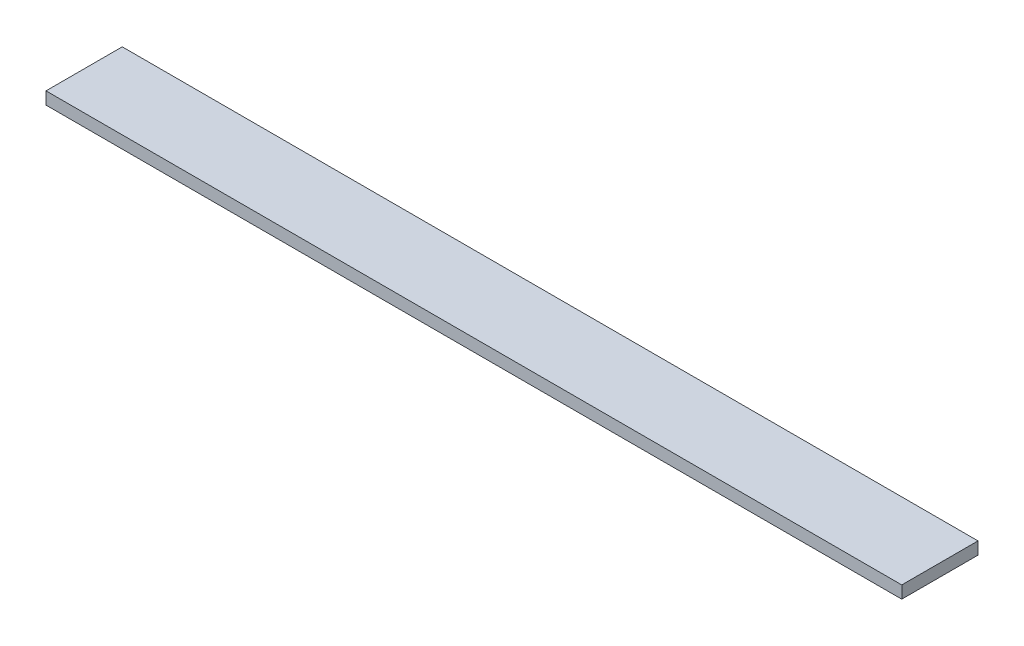
ISO-10303-21;
HEADER;
FILE_DESCRIPTION(('STEP AP214'),'2;1');
FILE_NAME('part.step','',(''),(''),'','','');
FILE_SCHEMA(('AUTOMOTIVE_DESIGN { 1 0 10303 214 1 1 1 1 }'));
ENDSEC;
DATA;
#1=APPLICATION_CONTEXT('core data for automotive mechanical design processes');
#2=APPLICATION_PROTOCOL_DEFINITION('international standard','automotive_design',2000,#1);
#3=PRODUCT_CONTEXT('',#1,'mechanical');
#4=PRODUCT('Part','Part','',(#3));
#5=PRODUCT_RELATED_PRODUCT_CATEGORY('part','',(#4));
#6=PRODUCT_DEFINITION_FORMATION('','',#4);
#7=PRODUCT_DEFINITION_CONTEXT('part definition',#1,'design');
#8=PRODUCT_DEFINITION('design','',#6,#7);
#9=PRODUCT_DEFINITION_SHAPE('','',#8);
#10=(LENGTH_UNIT() NAMED_UNIT(*) SI_UNIT(.MILLI.,.METRE.));
#11=(NAMED_UNIT(*) PLANE_ANGLE_UNIT() SI_UNIT($,.RADIAN.));
#12=(NAMED_UNIT(*) SI_UNIT($,.STERADIAN.) SOLID_ANGLE_UNIT());
#13=UNCERTAINTY_MEASURE_WITH_UNIT(LENGTH_MEASURE(1.E-05),#10,'distance_accuracy_value','');
#14=(GEOMETRIC_REPRESENTATION_CONTEXT(3) GLOBAL_UNCERTAINTY_ASSIGNED_CONTEXT((#13)) GLOBAL_UNIT_ASSIGNED_CONTEXT((#10,
#11,#12)) REPRESENTATION_CONTEXT('',''));
#15=CARTESIAN_POINT('',(0.,0.,0.));
#16=DIRECTION('',(0.,0.,1.));
#17=DIRECTION('',(1.,0.,0.));
#18=AXIS2_PLACEMENT_3D('',#15,#16,#17);
#19=CARTESIAN_POINT('',(-721.173913043478,38.1,-422.058695652174));
#20=DIRECTION('',(1.,0.,0.));
#21=DIRECTION('',(0.,0.,-1.));
#22=AXIS2_PLACEMENT_3D('',#19,#20,#21);
#23=PLANE('',#22);
#24=DIRECTION('',(0.,0.,1.));
#25=VECTOR('',#24,1.);
#26=CARTESIAN_POINT('',(-721.173913043478,0.,-422.058695652174));
#27=LINE('',#26,#25);
#28=CARTESIAN_POINT('',(-721.173913043478,0.,-422.058695652174));
#29=VERTEX_POINT('',#28);
#30=CARTESIAN_POINT('',(-721.173913043478,0.,-187.108695652174));
#31=VERTEX_POINT('',#30);
#32=EDGE_CURVE('E95',#29,#31,#27,.T.);
#33=ORIENTED_EDGE('',*,*,#32,.T.);
#34=DIRECTION('',(0.,-1.,0.));
#35=VECTOR('',#34,1.);
#36=CARTESIAN_POINT('',(-721.173913043478,38.1,-187.108695652174));
#37=LINE('',#36,#35);
#38=CARTESIAN_POINT('',(-721.173913043478,38.1,-187.108695652174));
#39=VERTEX_POINT('',#38);
#40=EDGE_CURVE('E11',#39,#31,#37,.T.);
#41=ORIENTED_EDGE('',*,*,#40,.F.);
#42=DIRECTION('',(0.,0.,1.));
#43=VECTOR('',#42,1.);
#44=CARTESIAN_POINT('',(-721.173913043478,38.1,-422.058695652174));
#45=LINE('',#44,#43);
#46=CARTESIAN_POINT('',(-721.173913043478,38.1,-422.058695652174));
#47=VERTEX_POINT('',#46);
#48=EDGE_CURVE('E81',#47,#39,#45,.T.);
#49=ORIENTED_EDGE('',*,*,#48,.F.);
#50=DIRECTION('',(0.,-1.,0.));
#51=VECTOR('',#50,1.);
#52=CARTESIAN_POINT('',(-721.173913043478,38.1,-422.058695652174));
#53=LINE('',#52,#51);
#54=EDGE_CURVE('E48',#47,#29,#53,.T.);
#55=ORIENTED_EDGE('',*,*,#54,.T.);
#56=EDGE_LOOP('',(#33,#41,#49,#55));
#57=FACE_BOUND('',#56,.T.);
#58=ADVANCED_FACE('F32',(#57),#23,.F.);
#59=CARTESIAN_POINT('',(-721.173913043478,38.1,-187.108695652174));
#60=DIRECTION('',(0.,0.,-1.));
#61=DIRECTION('',(-1.,0.,0.));
#62=AXIS2_PLACEMENT_3D('',#59,#60,#61);
#63=PLANE('',#62);
#64=DIRECTION('',(1.,0.,0.));
#65=VECTOR('',#64,1.);
#66=CARTESIAN_POINT('',(-721.173913043478,0.,-187.108695652174));
#67=LINE('',#66,#65);
#68=CARTESIAN_POINT('',(1915.66358695652,0.,-187.108695652174));
#69=VERTEX_POINT('',#68);
#70=EDGE_CURVE('E86',#31,#69,#67,.T.);
#71=ORIENTED_EDGE('',*,*,#70,.T.);
#72=DIRECTION('',(0.,-1.,0.));
#73=VECTOR('',#72,1.);
#74=CARTESIAN_POINT('',(1915.66358695652,38.1,-187.108695652174));
#75=LINE('',#74,#73);
#76=CARTESIAN_POINT('',(1915.66358695652,38.1,-187.108695652174));
#77=VERTEX_POINT('',#76);
#78=EDGE_CURVE('E40',#77,#69,#75,.T.);
#79=ORIENTED_EDGE('',*,*,#78,.F.);
#80=DIRECTION('',(1.,0.,0.));
#81=VECTOR('',#80,1.);
#82=CARTESIAN_POINT('',(-721.173913043478,38.1,-187.108695652174));
#83=LINE('',#82,#81);
#84=EDGE_CURVE('E73',#39,#77,#83,.T.);
#85=ORIENTED_EDGE('',*,*,#84,.F.);
#86=ORIENTED_EDGE('',*,*,#40,.T.);
#87=EDGE_LOOP('',(#71,#79,#85,#86));
#88=FACE_BOUND('',#87,.T.);
#89=ADVANCED_FACE('F85',(#88),#63,.F.);
#90=CARTESIAN_POINT('',(1915.66358695652,38.1,-422.058695652174));
#91=DIRECTION('',(1.,0.,0.));
#92=DIRECTION('',(0.,0.,-1.));
#93=AXIS2_PLACEMENT_3D('',#90,#91,#92);
#94=PLANE('',#93);
#95=DIRECTION('',(0.,0.,1.));
#96=VECTOR('',#95,1.);
#97=CARTESIAN_POINT('',(1915.66358695652,0.,-422.058695652174));
#98=LINE('',#97,#96);
#99=CARTESIAN_POINT('',(1915.66358695652,0.,-422.058695652174));
#100=VERTEX_POINT('',#99);
#101=EDGE_CURVE('E98',#100,#69,#98,.T.);
#102=ORIENTED_EDGE('',*,*,#101,.F.);
#103=DIRECTION('',(0.,-1.,0.));
#104=VECTOR('',#103,1.);
#105=CARTESIAN_POINT('',(1915.66358695652,38.1,-422.058695652174));
#106=LINE('',#105,#104);
#107=CARTESIAN_POINT('',(1915.66358695652,38.1,-422.058695652174));
#108=VERTEX_POINT('',#107);
#109=EDGE_CURVE('E62',#108,#100,#106,.T.);
#110=ORIENTED_EDGE('',*,*,#109,.F.);
#111=DIRECTION('',(0.,0.,1.));
#112=VECTOR('',#111,1.);
#113=CARTESIAN_POINT('',(1915.66358695652,38.1,-422.058695652174));
#114=LINE('',#113,#112);
#115=EDGE_CURVE('E80',#108,#77,#114,.T.);
#116=ORIENTED_EDGE('',*,*,#115,.T.);
#117=ORIENTED_EDGE('',*,*,#78,.T.);
#118=EDGE_LOOP('',(#102,#110,#116,#117));
#119=FACE_BOUND('',#118,.T.);
#120=ADVANCED_FACE('F89',(#119),#94,.T.);
#121=CARTESIAN_POINT('',(-721.173913043478,38.1,-422.058695652174));
#122=DIRECTION('',(0.,0.,-1.));
#123=DIRECTION('',(-1.,0.,0.));
#124=AXIS2_PLACEMENT_3D('',#121,#122,#123);
#125=PLANE('',#124);
#126=DIRECTION('',(1.,0.,0.));
#127=VECTOR('',#126,1.);
#128=CARTESIAN_POINT('',(-721.173913043478,0.,-422.058695652174));
#129=LINE('',#128,#127);
#130=EDGE_CURVE('E100',#29,#100,#129,.T.);
#131=ORIENTED_EDGE('',*,*,#130,.F.);
#132=ORIENTED_EDGE('',*,*,#54,.F.);
#133=DIRECTION('',(1.,0.,0.));
#134=VECTOR('',#133,1.);
#135=CARTESIAN_POINT('',(-721.173913043478,38.1,-422.058695652174));
#136=LINE('',#135,#134);
#137=EDGE_CURVE('E90',#47,#108,#136,.T.);
#138=ORIENTED_EDGE('',*,*,#137,.T.);
#139=ORIENTED_EDGE('',*,*,#109,.T.);
#140=EDGE_LOOP('',(#131,#132,#138,#139));
#141=FACE_BOUND('',#140,.T.);
#142=ADVANCED_FACE('F106',(#141),#125,.T.);
#143=CARTESIAN_POINT('',(0.,38.1,0.));
#144=DIRECTION('',(0.,1.,0.));
#145=DIRECTION('',(0.,0.,1.));
#146=AXIS2_PLACEMENT_3D('',#143,#144,#145);
#147=PLANE('',#146);
#148=ORIENTED_EDGE('',*,*,#48,.T.);
#149=ORIENTED_EDGE('',*,*,#84,.T.);
#150=ORIENTED_EDGE('',*,*,#115,.F.);
#151=ORIENTED_EDGE('',*,*,#137,.F.);
#152=EDGE_LOOP('',(#148,#149,#150,#151));
#153=FACE_BOUND('',#152,.T.);
#154=ADVANCED_FACE('F77',(#153),#147,.T.);
#155=CARTESIAN_POINT('',(0.,0.,0.));
#156=DIRECTION('',(0.,1.,0.));
#157=DIRECTION('',(0.,0.,1.));
#158=AXIS2_PLACEMENT_3D('',#155,#156,#157);
#159=PLANE('',#158);
#160=ORIENTED_EDGE('',*,*,#32,.F.);
#161=ORIENTED_EDGE('',*,*,#130,.T.);
#162=ORIENTED_EDGE('',*,*,#101,.T.);
#163=ORIENTED_EDGE('',*,*,#70,.F.);
#164=EDGE_LOOP('',(#160,#161,#162,#163));
#165=FACE_BOUND('',#164,.T.);
#166=ADVANCED_FACE('F105',(#165),#159,.F.);
#167=CLOSED_SHELL('',(#58,#89,#120,#142,#154,#166));
#168=MANIFOLD_SOLID_BREP('B2',#167);
#169=ADVANCED_BREP_SHAPE_REPRESENTATION('',(#18,#168),#14);
#170=SHAPE_DEFINITION_REPRESENTATION(#9,#169);
ENDSEC;
END-ISO-10303-21;
